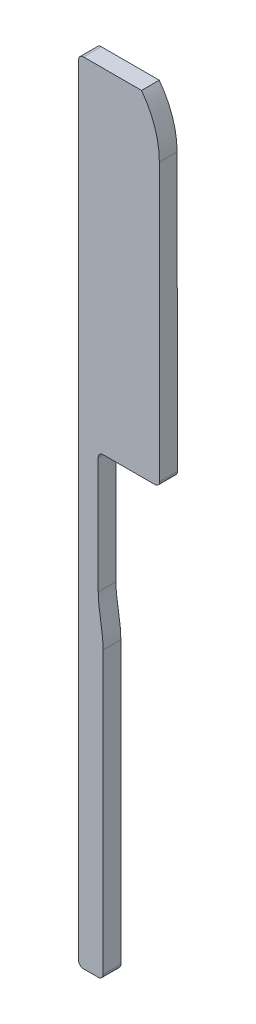
ISO-10303-21;
HEADER;
FILE_DESCRIPTION(('STEP AP214'),'2;1');
FILE_NAME('part.step','',(''),(''),'','','');
FILE_SCHEMA(('AUTOMOTIVE_DESIGN { 1 0 10303 214 1 1 1 1 }'));
ENDSEC;
DATA;
#1=APPLICATION_CONTEXT('core data for automotive mechanical design processes');
#2=APPLICATION_PROTOCOL_DEFINITION('international standard','automotive_design',2000,#1);
#3=PRODUCT_CONTEXT('',#1,'mechanical');
#4=PRODUCT('Part','Part','',(#3));
#5=PRODUCT_RELATED_PRODUCT_CATEGORY('part','',(#4));
#6=PRODUCT_DEFINITION_FORMATION('','',#4);
#7=PRODUCT_DEFINITION_CONTEXT('part definition',#1,'design');
#8=PRODUCT_DEFINITION('design','',#6,#7);
#9=PRODUCT_DEFINITION_SHAPE('','',#8);
#10=(LENGTH_UNIT() NAMED_UNIT(*) SI_UNIT(.MILLI.,.METRE.));
#11=(NAMED_UNIT(*) PLANE_ANGLE_UNIT() SI_UNIT($,.RADIAN.));
#12=(NAMED_UNIT(*) SI_UNIT($,.STERADIAN.) SOLID_ANGLE_UNIT());
#13=UNCERTAINTY_MEASURE_WITH_UNIT(LENGTH_MEASURE(1.E-05),#10,'distance_accuracy_value','');
#14=(GEOMETRIC_REPRESENTATION_CONTEXT(3) GLOBAL_UNCERTAINTY_ASSIGNED_CONTEXT((#13)) GLOBAL_UNIT_ASSIGNED_CONTEXT((#10,
#11,#12)) REPRESENTATION_CONTEXT('',''));
#15=CARTESIAN_POINT('',(0.,0.,0.));
#16=DIRECTION('',(0.,0.,1.));
#17=DIRECTION('',(1.,0.,0.));
#18=AXIS2_PLACEMENT_3D('',#15,#16,#17);
#19=CARTESIAN_POINT('',(12.5,32.33,1.8));
#20=DIRECTION('',(-1.,0.,0.));
#21=DIRECTION('',(0.,-1.,0.));
#22=AXIS2_PLACEMENT_3D('',#19,#20,#21);
#23=PLANE('',#22);
#24=DIRECTION('',(0.,1.,0.));
#25=VECTOR('',#24,1.);
#26=CARTESIAN_POINT('',(12.5,32.33,1.8));
#27=LINE('',#26,#25);
#28=CARTESIAN_POINT('',(12.5,3.77,1.8));
#29=VERTEX_POINT('',#28);
#30=CARTESIAN_POINT('',(12.5,32.33,1.8));
#31=VERTEX_POINT('',#30);
#32=EDGE_CURVE('E143',#29,#31,#27,.T.);
#33=ORIENTED_EDGE('',*,*,#32,.F.);
#34=DIRECTION('',(0.,0.,-1.));
#35=VECTOR('',#34,1.);
#36=CARTESIAN_POINT('',(12.5,3.77,1.8));
#37=LINE('',#36,#35);
#38=CARTESIAN_POINT('',(12.5,3.77,0.));
#39=VERTEX_POINT('',#38);
#40=EDGE_CURVE('E11',#29,#39,#37,.T.);
#41=ORIENTED_EDGE('',*,*,#40,.T.);
#42=DIRECTION('',(0.,1.,0.));
#43=VECTOR('',#42,1.);
#44=CARTESIAN_POINT('',(12.5,32.33,0.));
#45=LINE('',#44,#43);
#46=CARTESIAN_POINT('',(12.5,32.33,0.));
#47=VERTEX_POINT('',#46);
#48=EDGE_CURVE('E161',#39,#47,#45,.T.);
#49=ORIENTED_EDGE('',*,*,#48,.T.);
#50=DIRECTION('',(0.,0.,-1.));
#51=VECTOR('',#50,1.);
#52=CARTESIAN_POINT('',(12.5,32.33,1.8));
#53=LINE('',#52,#51);
#54=EDGE_CURVE('E159',#31,#47,#53,.T.);
#55=ORIENTED_EDGE('',*,*,#54,.F.);
#56=EDGE_LOOP('',(#33,#41,#49,#55));
#57=FACE_BOUND('',#56,.T.);
#58=ADVANCED_FACE('F40',(#57),#23,.F.);
#59=CARTESIAN_POINT('',(12.5,32.33,1.8));
#60=CARTESIAN_POINT('',(12.5,33.9722823380889,1.8));
#61=CARTESIAN_POINT('',(12.,35.554764974261,1.8));
#62=CARTESIAN_POINT('',(12.,37.18,1.8));
#63=B_SPLINE_CURVE_WITH_KNOTS('',3,(#59,#60,#61,#62),.UNSPECIFIED.,.F.,.F.,(4,4),(0.,1.),.UNSPECIFIED.);
#64=DIRECTION('',(0.,0.,-1.));
#65=VECTOR('',#64,1.);
#66=SURFACE_OF_LINEAR_EXTRUSION('',#63,#65);
#67=CARTESIAN_POINT('',(12.5,32.33,0.));
#68=CARTESIAN_POINT('',(12.5,33.9722823380889,0.));
#69=CARTESIAN_POINT('',(12.,35.554764974261,0.));
#70=CARTESIAN_POINT('',(12.,37.18,0.));
#71=B_SPLINE_CURVE_WITH_KNOTS('',3,(#67,#68,#69,#70),.UNSPECIFIED.,.F.,.F.,(4,4),(0.,1.),.UNSPECIFIED.);
#72=CARTESIAN_POINT('',(12.,37.18,0.));
#73=VERTEX_POINT('',#72);
#74=EDGE_CURVE('E306',#47,#73,#71,.T.);
#75=ORIENTED_EDGE('',*,*,#74,.T.);
#76=DIRECTION('',(0.,0.,-1.));
#77=VECTOR('',#76,1.);
#78=CARTESIAN_POINT('',(12.,37.18,1.8));
#79=LINE('',#78,#77);
#80=CARTESIAN_POINT('',(12.,37.18,1.8));
#81=VERTEX_POINT('',#80);
#82=EDGE_CURVE('E166',#81,#73,#79,.T.);
#83=ORIENTED_EDGE('',*,*,#82,.F.);
#84=EDGE_CURVE('E149',#31,#81,#63,.T.);
#85=ORIENTED_EDGE('',*,*,#84,.F.);
#86=ORIENTED_EDGE('',*,*,#54,.T.);
#87=EDGE_LOOP('',(#75,#83,#85,#86));
#88=FACE_BOUND('',#87,.T.);
#89=ADVANCED_FACE('F168',(#88),#66,.F.);
#90=CARTESIAN_POINT('',(12.,49.5,1.8));
#91=DIRECTION('',(-1.,0.,0.));
#92=DIRECTION('',(0.,-1.,0.));
#93=AXIS2_PLACEMENT_3D('',#90,#91,#92);
#94=PLANE('',#93);
#95=DIRECTION('',(0.,1.,0.));
#96=VECTOR('',#95,1.);
#97=CARTESIAN_POINT('',(12.,49.5,0.));
#98=LINE('',#97,#96);
#99=CARTESIAN_POINT('',(12.,49.,0.));
#100=VERTEX_POINT('',#99);
#101=EDGE_CURVE('E302',#73,#100,#98,.T.);
#102=ORIENTED_EDGE('',*,*,#101,.T.);
#103=DIRECTION('',(0.,0.,-1.));
#104=VECTOR('',#103,1.);
#105=CARTESIAN_POINT('',(12.,49.,1.8));
#106=LINE('',#105,#104);
#107=CARTESIAN_POINT('',(12.,49.,1.8));
#108=VERTEX_POINT('',#107);
#109=EDGE_CURVE('E243',#100,#108,#106,.F.);
#110=ORIENTED_EDGE('',*,*,#109,.T.);
#111=DIRECTION('',(0.,1.,0.));
#112=VECTOR('',#111,1.);
#113=CARTESIAN_POINT('',(12.,49.5,1.8));
#114=LINE('',#113,#112);
#115=EDGE_CURVE('E172',#81,#108,#114,.T.);
#116=ORIENTED_EDGE('',*,*,#115,.F.);
#117=ORIENTED_EDGE('',*,*,#82,.T.);
#118=EDGE_LOOP('',(#102,#110,#116,#117));
#119=FACE_BOUND('',#118,.T.);
#120=ADVANCED_FACE('F189',(#119),#94,.F.);
#121=CARTESIAN_POINT('',(18.25,49.5,1.8));
#122=DIRECTION('',(0.,1.,0.));
#123=DIRECTION('',(0.,0.,1.));
#124=AXIS2_PLACEMENT_3D('',#121,#122,#123);
#125=PLANE('',#124);
#126=DIRECTION('',(1.,0.,0.));
#127=VECTOR('',#126,1.);
#128=CARTESIAN_POINT('',(18.25,49.5,0.));
#129=LINE('',#128,#127);
#130=CARTESIAN_POINT('',(12.5,49.5,0.));
#131=VERTEX_POINT('',#130);
#132=CARTESIAN_POINT('',(17.7493403583769,49.5,0.));
#133=VERTEX_POINT('',#132);
#134=EDGE_CURVE('E298',#131,#133,#129,.T.);
#135=ORIENTED_EDGE('',*,*,#134,.T.);
#136=DIRECTION('',(0.,0.,-1.));
#137=VECTOR('',#136,1.);
#138=CARTESIAN_POINT('',(17.7493403583769,49.5,1.8));
#139=LINE('',#138,#137);
#140=CARTESIAN_POINT('',(17.7493403583769,49.5,1.8));
#141=VERTEX_POINT('',#140);
#142=EDGE_CURVE('E249',#133,#141,#139,.F.);
#143=ORIENTED_EDGE('',*,*,#142,.T.);
#144=DIRECTION('',(1.,0.,0.));
#145=VECTOR('',#144,1.);
#146=CARTESIAN_POINT('',(18.25,49.5,1.8));
#147=LINE('',#146,#145);
#148=CARTESIAN_POINT('',(12.5,49.5,1.8));
#149=VERTEX_POINT('',#148);
#150=EDGE_CURVE('E175',#149,#141,#147,.T.);
#151=ORIENTED_EDGE('',*,*,#150,.F.);
#152=DIRECTION('',(0.,0.,-1.));
#153=VECTOR('',#152,1.);
#154=CARTESIAN_POINT('',(12.5,49.5,0.));
#155=LINE('',#154,#153);
#156=EDGE_CURVE('E252',#149,#131,#155,.T.);
#157=ORIENTED_EDGE('',*,*,#156,.T.);
#158=EDGE_LOOP('',(#135,#143,#151,#157));
#159=FACE_BOUND('',#158,.T.);
#160=ADVANCED_FACE('F365',(#159),#125,.F.);
#161=CARTESIAN_POINT('',(18.2122992950021,78.0954950668466,1.8));
#162=DIRECTION('',(-0.999999130893212,-0.00131841299280958,0.));
#163=DIRECTION('',(0.00131841299280959,-0.999999130893213,0.));
#164=AXIS2_PLACEMENT_3D('',#161,#162,#163);
#165=PLANE('',#164);
#166=DIRECTION('',(-0.00131841299280958,0.999999130893212,0.));
#167=VECTOR('',#166,1.);
#168=CARTESIAN_POINT('',(18.2122992950021,78.0954950668466,1.8));
#169=LINE('',#168,#167);
#170=CARTESIAN_POINT('',(18.2493399238235,50.0006592064964,1.8));
#171=VERTEX_POINT('',#170);
#172=CARTESIAN_POINT('',(18.2122992950021,78.0954950668466,1.8));
#173=VERTEX_POINT('',#172);
#174=EDGE_CURVE('E326',#171,#173,#169,.T.);
#175=ORIENTED_EDGE('',*,*,#174,.F.);
#176=DIRECTION('',(0.,0.,-1.));
#177=VECTOR('',#176,1.);
#178=CARTESIAN_POINT('',(18.2493399238235,50.0006592064964,1.8));
#179=LINE('',#178,#177);
#180=CARTESIAN_POINT('',(18.2493399238235,50.0006592064964,0.));
#181=VERTEX_POINT('',#180);
#182=EDGE_CURVE('E256',#171,#181,#179,.T.);
#183=ORIENTED_EDGE('',*,*,#182,.T.);
#184=DIRECTION('',(-0.00131841299280958,0.999999130893212,0.));
#185=VECTOR('',#184,1.);
#186=CARTESIAN_POINT('',(18.2122992950021,78.0954950668466,0.));
#187=LINE('',#186,#185);
#188=CARTESIAN_POINT('',(18.2122992950021,78.0954950668466,0.));
#189=VERTEX_POINT('',#188);
#190=EDGE_CURVE('E295',#181,#189,#187,.T.);
#191=ORIENTED_EDGE('',*,*,#190,.T.);
#192=DIRECTION('',(0.,0.,-1.));
#193=VECTOR('',#192,1.);
#194=CARTESIAN_POINT('',(18.2122992950021,78.0954950668466,1.8));
#195=LINE('',#194,#193);
#196=EDGE_CURVE('E277',#173,#189,#195,.T.);
#197=ORIENTED_EDGE('',*,*,#196,.F.);
#198=EDGE_LOOP('',(#175,#183,#191,#197));
#199=FACE_BOUND('',#198,.T.);
#200=ADVANCED_FACE('F340',(#199),#165,.F.);
#201=CARTESIAN_POINT('',(9.2123071169632,78.0836293499113,1.8));
#202=DIRECTION('',(0.,0.,-1.));
#203=DIRECTION('',(-1.,0.,0.));
#204=AXIS2_PLACEMENT_3D('',#201,#202,#203);
#205=CYLINDRICAL_SURFACE('',#204,9.);
#206=CARTESIAN_POINT('',(9.2123071169632,78.0836293499113,0.));
#207=DIRECTION('',(0.,0.,1.));
#208=DIRECTION('',(-1.,0.,0.));
#209=AXIS2_PLACEMENT_3D('',#206,#207,#208);
#210=CIRCLE('',#209,9.);
#211=CARTESIAN_POINT('',(16.4,83.5,0.));
#212=VERTEX_POINT('',#211);
#213=EDGE_CURVE('E292',#189,#212,#210,.T.);
#214=ORIENTED_EDGE('',*,*,#213,.T.);
#215=DIRECTION('',(0.,0.,-1.));
#216=VECTOR('',#215,1.);
#217=CARTESIAN_POINT('',(16.4,83.5,1.8));
#218=LINE('',#217,#216);
#219=CARTESIAN_POINT('',(16.4,83.5,1.8));
#220=VERTEX_POINT('',#219);
#221=EDGE_CURVE('E281',#220,#212,#218,.T.);
#222=ORIENTED_EDGE('',*,*,#221,.F.);
#223=CARTESIAN_POINT('',(9.2123071169632,78.0836293499113,1.8));
#224=DIRECTION('',(0.,0.,1.));
#225=DIRECTION('',(-1.,0.,0.));
#226=AXIS2_PLACEMENT_3D('',#223,#224,#225);
#227=CIRCLE('',#226,9.);
#228=EDGE_CURVE('E323',#173,#220,#227,.T.);
#229=ORIENTED_EDGE('',*,*,#228,.F.);
#230=ORIENTED_EDGE('',*,*,#196,.T.);
#231=EDGE_LOOP('',(#214,#222,#229,#230));
#232=FACE_BOUND('',#231,.T.);
#233=ADVANCED_FACE('F347',(#232),#205,.T.);
#234=CARTESIAN_POINT('',(10.,83.5,1.8));
#235=DIRECTION('',(0.,-1.,0.));
#236=DIRECTION('',(0.,0.,-1.));
#237=AXIS2_PLACEMENT_3D('',#234,#235,#236);
#238=PLANE('',#237);
#239=DIRECTION('',(-1.,0.,0.));
#240=VECTOR('',#239,1.);
#241=CARTESIAN_POINT('',(10.,83.5,0.));
#242=LINE('',#241,#240);
#243=CARTESIAN_POINT('',(10.5,83.5,0.));
#244=VERTEX_POINT('',#243);
#245=EDGE_CURVE('E288',#212,#244,#242,.T.);
#246=ORIENTED_EDGE('',*,*,#245,.T.);
#247=DIRECTION('',(0.,0.,-1.));
#248=VECTOR('',#247,1.);
#249=CARTESIAN_POINT('',(10.5,83.5,1.8));
#250=LINE('',#249,#248);
#251=CARTESIAN_POINT('',(10.5,83.5,1.8));
#252=VERTEX_POINT('',#251);
#253=EDGE_CURVE('E246',#244,#252,#250,.F.);
#254=ORIENTED_EDGE('',*,*,#253,.T.);
#255=DIRECTION('',(-1.,0.,0.));
#256=VECTOR('',#255,1.);
#257=CARTESIAN_POINT('',(10.,83.5,1.8));
#258=LINE('',#257,#256);
#259=EDGE_CURVE('E319',#220,#252,#258,.T.);
#260=ORIENTED_EDGE('',*,*,#259,.F.);
#261=ORIENTED_EDGE('',*,*,#221,.T.);
#262=EDGE_LOOP('',(#246,#254,#260,#261));
#263=FACE_BOUND('',#262,.T.);
#264=ADVANCED_FACE('F351',(#263),#238,.F.);
#265=CARTESIAN_POINT('',(10.,14.4,1.8));
#266=DIRECTION('',(1.,0.,0.));
#267=DIRECTION('',(0.,0.,-1.));
#268=AXIS2_PLACEMENT_3D('',#265,#266,#267);
#269=PLANE('',#268);
#270=DIRECTION('',(0.,-1.,0.));
#271=VECTOR('',#270,1.);
#272=CARTESIAN_POINT('',(10.,14.4,0.));
#273=LINE('',#272,#271);
#274=CARTESIAN_POINT('',(10.,83.,0.));
#275=VERTEX_POINT('',#274);
#276=CARTESIAN_POINT('',(10.,3.77,0.));
#277=VERTEX_POINT('',#276);
#278=EDGE_CURVE('E156',#275,#277,#273,.T.);
#279=ORIENTED_EDGE('',*,*,#278,.T.);
#280=DIRECTION('',(0.,0.,1.));
#281=VECTOR('',#280,1.);
#282=CARTESIAN_POINT('',(10.,3.77,1.8));
#283=LINE('',#282,#281);
#284=CARTESIAN_POINT('',(10.,3.77,1.8));
#285=VERTEX_POINT('',#284);
#286=EDGE_CURVE('E217',#277,#285,#283,.T.);
#287=ORIENTED_EDGE('',*,*,#286,.T.);
#288=DIRECTION('',(0.,-1.,0.));
#289=VECTOR('',#288,1.);
#290=CARTESIAN_POINT('',(10.,14.4,1.8));
#291=LINE('',#290,#289);
#292=CARTESIAN_POINT('',(10.,83.,1.8));
#293=VERTEX_POINT('',#292);
#294=EDGE_CURVE('E285',#293,#285,#291,.T.);
#295=ORIENTED_EDGE('',*,*,#294,.F.);
#296=DIRECTION('',(0.,0.,-1.));
#297=VECTOR('',#296,1.);
#298=CARTESIAN_POINT('',(10.,83.,1.8));
#299=LINE('',#298,#297);
#300=EDGE_CURVE('E260',#293,#275,#299,.T.);
#301=ORIENTED_EDGE('',*,*,#300,.T.);
#302=EDGE_LOOP('',(#279,#287,#295,#301));
#303=FACE_BOUND('',#302,.T.);
#304=ADVANCED_FACE('F357',(#303),#269,.F.);
#305=CARTESIAN_POINT('',(9.43,12.1305444444445,1.8));
#306=DIRECTION('',(0.,0.,-1.));
#307=DIRECTION('',(-1.,0.,0.));
#308=AXIS2_PLACEMENT_3D('',#305,#306,#307);
#309=PLANE('',#308);
#310=ORIENTED_EDGE('',*,*,#294,.T.);
#311=CARTESIAN_POINT('',(10.5,3.77,1.8));
#312=DIRECTION('',(0.,0.,-1.));
#313=DIRECTION('',(-1.,0.,0.));
#314=AXIS2_PLACEMENT_3D('',#311,#312,#313);
#315=CIRCLE('',#314,0.5);
#316=CARTESIAN_POINT('',(10.5,3.27,1.8));
#317=VERTEX_POINT('',#316);
#318=EDGE_CURVE('E230',#285,#317,#315,.F.);
#319=ORIENTED_EDGE('',*,*,#318,.T.);
#320=DIRECTION('',(-1.,0.,0.));
#321=VECTOR('',#320,1.);
#322=CARTESIAN_POINT('',(10.,3.27,1.8));
#323=LINE('',#322,#321);
#324=CARTESIAN_POINT('',(12.,3.27,1.8));
#325=VERTEX_POINT('',#324);
#326=EDGE_CURVE('E358',#325,#317,#323,.T.);
#327=ORIENTED_EDGE('',*,*,#326,.F.);
#328=CARTESIAN_POINT('',(12.,3.77,1.8));
#329=DIRECTION('',(0.,0.,-1.));
#330=DIRECTION('',(-1.,0.,0.));
#331=AXIS2_PLACEMENT_3D('',#328,#329,#330);
#332=CIRCLE('',#331,0.5);
#333=EDGE_CURVE('E153',#325,#29,#332,.F.);
#334=ORIENTED_EDGE('',*,*,#333,.T.);
#335=ORIENTED_EDGE('',*,*,#32,.T.);
#336=ORIENTED_EDGE('',*,*,#84,.T.);
#337=ORIENTED_EDGE('',*,*,#115,.T.);
#338=CARTESIAN_POINT('',(12.5,49.,1.8));
#339=DIRECTION('',(0.,0.,-1.));
#340=DIRECTION('',(-1.,0.,0.));
#341=AXIS2_PLACEMENT_3D('',#338,#339,#340);
#342=CIRCLE('',#341,0.5);
#343=EDGE_CURVE('E237',#108,#149,#342,.T.);
#344=ORIENTED_EDGE('',*,*,#343,.T.);
#345=ORIENTED_EDGE('',*,*,#150,.T.);
#346=CARTESIAN_POINT('',(17.7493403583769,50.,1.8));
#347=DIRECTION('',(0.,0.,-1.));
#348=DIRECTION('',(-1.,0.,0.));
#349=AXIS2_PLACEMENT_3D('',#346,#347,#348);
#350=CIRCLE('',#349,0.5);
#351=EDGE_CURVE('E264',#141,#171,#350,.F.);
#352=ORIENTED_EDGE('',*,*,#351,.T.);
#353=ORIENTED_EDGE('',*,*,#174,.T.);
#354=ORIENTED_EDGE('',*,*,#228,.T.);
#355=ORIENTED_EDGE('',*,*,#259,.T.);
#356=CARTESIAN_POINT('',(10.5,83.,1.8));
#357=DIRECTION('',(0.,0.,-1.));
#358=DIRECTION('',(-1.,0.,0.));
#359=AXIS2_PLACEMENT_3D('',#356,#357,#358);
#360=CIRCLE('',#359,0.5);
#361=EDGE_CURVE('E267',#252,#293,#360,.F.);
#362=ORIENTED_EDGE('',*,*,#361,.T.);
#363=EDGE_LOOP('',(#310,#319,#327,#334,#335,#336,#337,#344,#345,#352,#353,#354,#355,#362));
#364=FACE_BOUND('',#363,.T.);
#365=ADVANCED_FACE('F146',(#364),#309,.F.);
#366=CARTESIAN_POINT('',(9.43,12.1305444444445,0.));
#367=DIRECTION('',(0.,0.,-1.));
#368=DIRECTION('',(-1.,0.,0.));
#369=AXIS2_PLACEMENT_3D('',#366,#367,#368);
#370=PLANE('',#369);
#371=DIRECTION('',(-1.,0.,0.));
#372=VECTOR('',#371,1.);
#373=CARTESIAN_POINT('',(10.,3.27,0.));
#374=LINE('',#373,#372);
#375=CARTESIAN_POINT('',(12.,3.27,0.));
#376=VERTEX_POINT('',#375);
#377=CARTESIAN_POINT('',(10.5,3.27,0.));
#378=VERTEX_POINT('',#377);
#379=EDGE_CURVE('E316',#376,#378,#374,.T.);
#380=ORIENTED_EDGE('',*,*,#379,.T.);
#381=CARTESIAN_POINT('',(10.5,3.77,0.));
#382=DIRECTION('',(0.,0.,-1.));
#383=DIRECTION('',(-1.,0.,0.));
#384=AXIS2_PLACEMENT_3D('',#381,#382,#383);
#385=CIRCLE('',#384,0.5);
#386=EDGE_CURVE('E49',#378,#277,#385,.T.);
#387=ORIENTED_EDGE('',*,*,#386,.T.);
#388=ORIENTED_EDGE('',*,*,#278,.F.);
#389=CARTESIAN_POINT('',(10.5,83.,0.));
#390=DIRECTION('',(0.,0.,-1.));
#391=DIRECTION('',(-1.,0.,0.));
#392=AXIS2_PLACEMENT_3D('',#389,#390,#391);
#393=CIRCLE('',#392,0.5);
#394=EDGE_CURVE('E165',#275,#244,#393,.T.);
#395=ORIENTED_EDGE('',*,*,#394,.T.);
#396=ORIENTED_EDGE('',*,*,#245,.F.);
#397=ORIENTED_EDGE('',*,*,#213,.F.);
#398=ORIENTED_EDGE('',*,*,#190,.F.);
#399=CARTESIAN_POINT('',(17.7493403583769,50.,0.));
#400=DIRECTION('',(0.,0.,-1.));
#401=DIRECTION('',(-1.,0.,0.));
#402=AXIS2_PLACEMENT_3D('',#399,#400,#401);
#403=CIRCLE('',#402,0.5);
#404=EDGE_CURVE('E270',#181,#133,#403,.T.);
#405=ORIENTED_EDGE('',*,*,#404,.T.);
#406=ORIENTED_EDGE('',*,*,#134,.F.);
#407=CARTESIAN_POINT('',(12.5,49.,0.));
#408=DIRECTION('',(0.,0.,-1.));
#409=DIRECTION('',(-1.,0.,0.));
#410=AXIS2_PLACEMENT_3D('',#407,#408,#409);
#411=CIRCLE('',#410,0.5);
#412=EDGE_CURVE('E240',#131,#100,#411,.F.);
#413=ORIENTED_EDGE('',*,*,#412,.T.);
#414=ORIENTED_EDGE('',*,*,#101,.F.);
#415=ORIENTED_EDGE('',*,*,#74,.F.);
#416=ORIENTED_EDGE('',*,*,#48,.F.);
#417=CARTESIAN_POINT('',(12.,3.77,0.));
#418=DIRECTION('',(0.,0.,-1.));
#419=DIRECTION('',(-1.,0.,0.));
#420=AXIS2_PLACEMENT_3D('',#417,#418,#419);
#421=CIRCLE('',#420,0.5);
#422=EDGE_CURVE('E56',#39,#376,#421,.T.);
#423=ORIENTED_EDGE('',*,*,#422,.T.);
#424=EDGE_LOOP('',(#380,#387,#388,#395,#396,#397,#398,#405,#406,#413,#414,#415,#416,#423));
#425=FACE_BOUND('',#424,.T.);
#426=ADVANCED_FACE('F197',(#425),#370,.T.);
#427=CARTESIAN_POINT('',(17.7493403583769,50.,1.8));
#428=DIRECTION('',(0.,0.,-1.));
#429=DIRECTION('',(-1.,0.,0.));
#430=AXIS2_PLACEMENT_3D('',#427,#428,#429);
#431=CYLINDRICAL_SURFACE('',#430,0.5);
#432=ORIENTED_EDGE('',*,*,#351,.F.);
#433=ORIENTED_EDGE('',*,*,#142,.F.);
#434=ORIENTED_EDGE('',*,*,#404,.F.);
#435=ORIENTED_EDGE('',*,*,#182,.F.);
#436=EDGE_LOOP('',(#432,#433,#434,#435));
#437=FACE_BOUND('',#436,.T.);
#438=ADVANCED_FACE('F193',(#437),#431,.T.);
#439=CARTESIAN_POINT('',(10.5,83.,1.8));
#440=DIRECTION('',(0.,0.,-1.));
#441=DIRECTION('',(-1.,0.,0.));
#442=AXIS2_PLACEMENT_3D('',#439,#440,#441);
#443=CYLINDRICAL_SURFACE('',#442,0.5);
#444=ORIENTED_EDGE('',*,*,#361,.F.);
#445=ORIENTED_EDGE('',*,*,#253,.F.);
#446=ORIENTED_EDGE('',*,*,#394,.F.);
#447=ORIENTED_EDGE('',*,*,#300,.F.);
#448=EDGE_LOOP('',(#444,#445,#446,#447));
#449=FACE_BOUND('',#448,.T.);
#450=ADVANCED_FACE('F196',(#449),#443,.T.);
#451=CARTESIAN_POINT('',(12.5,49.,1.8));
#452=DIRECTION('',(0.,0.,1.));
#453=DIRECTION('',(1.,0.,0.));
#454=AXIS2_PLACEMENT_3D('',#451,#452,#453);
#455=CYLINDRICAL_SURFACE('',#454,0.5);
#456=ORIENTED_EDGE('',*,*,#343,.F.);
#457=ORIENTED_EDGE('',*,*,#109,.F.);
#458=ORIENTED_EDGE('',*,*,#412,.F.);
#459=ORIENTED_EDGE('',*,*,#156,.F.);
#460=EDGE_LOOP('',(#456,#457,#458,#459));
#461=FACE_BOUND('',#460,.T.);
#462=ADVANCED_FACE('F201',(#461),#455,.F.);
#463=CARTESIAN_POINT('',(10.,3.27,0.));
#464=DIRECTION('',(0.,1.,0.));
#465=DIRECTION('',(-1.,0.,0.));
#466=AXIS2_PLACEMENT_3D('',#463,#464,#465);
#467=PLANE('',#466);
#468=ORIENTED_EDGE('',*,*,#326,.T.);
#469=DIRECTION('',(0.,0.,1.));
#470=VECTOR('',#469,1.);
#471=CARTESIAN_POINT('',(10.5,3.27,0.));
#472=LINE('',#471,#470);
#473=EDGE_CURVE('E63',#317,#378,#472,.F.);
#474=ORIENTED_EDGE('',*,*,#473,.T.);
#475=ORIENTED_EDGE('',*,*,#379,.F.);
#476=DIRECTION('',(0.,0.,-1.));
#477=VECTOR('',#476,1.);
#478=CARTESIAN_POINT('',(12.,3.27,0.));
#479=LINE('',#478,#477);
#480=EDGE_CURVE('E227',#376,#325,#479,.F.);
#481=ORIENTED_EDGE('',*,*,#480,.T.);
#482=EDGE_LOOP('',(#468,#474,#475,#481));
#483=FACE_BOUND('',#482,.T.);
#484=ADVANCED_FACE('F204',(#483),#467,.F.);
#485=CARTESIAN_POINT('',(10.5,3.77,1.8));
#486=DIRECTION('',(0.,0.,1.));
#487=DIRECTION('',(1.,0.,0.));
#488=AXIS2_PLACEMENT_3D('',#485,#486,#487);
#489=CYLINDRICAL_SURFACE('',#488,0.5);
#490=ORIENTED_EDGE('',*,*,#386,.F.);
#491=ORIENTED_EDGE('',*,*,#473,.F.);
#492=ORIENTED_EDGE('',*,*,#318,.F.);
#493=ORIENTED_EDGE('',*,*,#286,.F.);
#494=EDGE_LOOP('',(#490,#491,#492,#493));
#495=FACE_BOUND('',#494,.T.);
#496=ADVANCED_FACE('F206',(#495),#489,.T.);
#497=CARTESIAN_POINT('',(12.,3.77,1.8));
#498=DIRECTION('',(0.,0.,-1.));
#499=DIRECTION('',(-1.,0.,0.));
#500=AXIS2_PLACEMENT_3D('',#497,#498,#499);
#501=CYLINDRICAL_SURFACE('',#500,0.5);
#502=ORIENTED_EDGE('',*,*,#333,.F.);
#503=ORIENTED_EDGE('',*,*,#480,.F.);
#504=ORIENTED_EDGE('',*,*,#422,.F.);
#505=ORIENTED_EDGE('',*,*,#40,.F.);
#506=EDGE_LOOP('',(#502,#503,#504,#505));
#507=FACE_BOUND('',#506,.T.);
#508=ADVANCED_FACE('F42',(#507),#501,.T.);
#509=CLOSED_SHELL('',(#58,#89,#120,#160,#200,#233,#264,#304,#365,#426,#438,#450,#462,#484,#496,#508));
#510=MANIFOLD_SOLID_BREP('B2',#509);
#511=ADVANCED_BREP_SHAPE_REPRESENTATION('',(#18,#510),#14);
#512=SHAPE_DEFINITION_REPRESENTATION(#9,#511);
ENDSEC;
END-ISO-10303-21;
